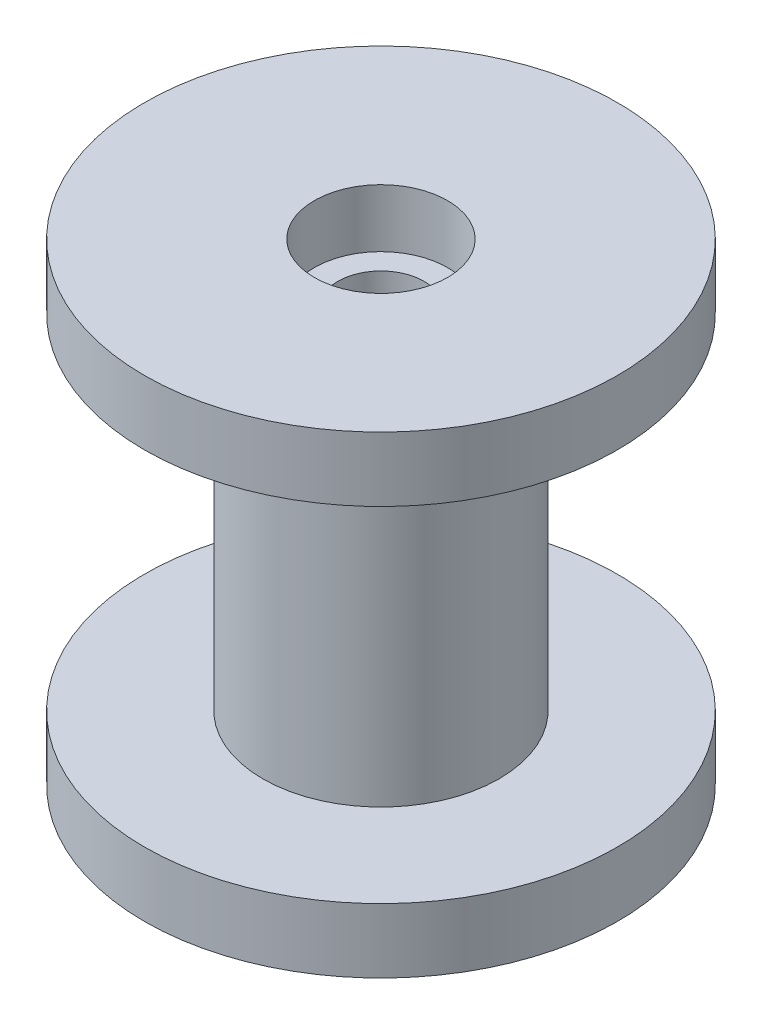
ISO-10303-21;
HEADER;
FILE_DESCRIPTION(('STEP AP214'),'2;1');
FILE_NAME('part.step','',(''),(''),'','','');
FILE_SCHEMA(('AUTOMOTIVE_DESIGN { 1 0 10303 214 1 1 1 1 }'));
ENDSEC;
DATA;
#1=APPLICATION_CONTEXT('core data for automotive mechanical design processes');
#2=APPLICATION_PROTOCOL_DEFINITION('international standard','automotive_design',2000,#1);
#3=PRODUCT_CONTEXT('',#1,'mechanical');
#4=PRODUCT('Part','Part','',(#3));
#5=PRODUCT_RELATED_PRODUCT_CATEGORY('part','',(#4));
#6=PRODUCT_DEFINITION_FORMATION('','',#4);
#7=PRODUCT_DEFINITION_CONTEXT('part definition',#1,'design');
#8=PRODUCT_DEFINITION('design','',#6,#7);
#9=PRODUCT_DEFINITION_SHAPE('','',#8);
#10=(LENGTH_UNIT() NAMED_UNIT(*) SI_UNIT(.MILLI.,.METRE.));
#11=(NAMED_UNIT(*) PLANE_ANGLE_UNIT() SI_UNIT($,.RADIAN.));
#12=(NAMED_UNIT(*) SI_UNIT($,.STERADIAN.) SOLID_ANGLE_UNIT());
#13=UNCERTAINTY_MEASURE_WITH_UNIT(LENGTH_MEASURE(1.E-05),#10,'distance_accuracy_value','');
#14=(GEOMETRIC_REPRESENTATION_CONTEXT(3) GLOBAL_UNCERTAINTY_ASSIGNED_CONTEXT((#13)) GLOBAL_UNIT_ASSIGNED_CONTEXT((#10,
#11,#12)) REPRESENTATION_CONTEXT('',''));
#15=CARTESIAN_POINT('',(0.,0.,0.));
#16=DIRECTION('',(0.,0.,1.));
#17=DIRECTION('',(1.,0.,0.));
#18=AXIS2_PLACEMENT_3D('',#15,#16,#17);
#19=CARTESIAN_POINT('',(0.,-11.,0.));
#20=DIRECTION('',(0.,1.,0.));
#21=DIRECTION('',(0.,0.,1.));
#22=AXIS2_PLACEMENT_3D('',#19,#20,#21);
#23=CYLINDRICAL_SURFACE('',#22,2.);
#24=CARTESIAN_POINT('',(0.,-8.3,0.));
#25=DIRECTION('',(0.,1.,0.));
#26=DIRECTION('',(0.,0.,1.));
#27=AXIS2_PLACEMENT_3D('',#24,#25,#26);
#28=CIRCLE('',#27,2.);
#29=CARTESIAN_POINT('',(0.,-8.3,2.));
#30=VERTEX_POINT('',#29);
#31=EDGE_CURVE('E39',#30,#30,#28,.F.);
#32=ORIENTED_EDGE('',*,*,#31,.T.);
#33=EDGE_LOOP('',(#32));
#34=FACE_BOUND('',#33,.T.);
#35=CARTESIAN_POINT('',(0.,8.3,0.));
#36=DIRECTION('',(0.,1.,0.));
#37=DIRECTION('',(0.,0.,1.));
#38=AXIS2_PLACEMENT_3D('',#35,#36,#37);
#39=CIRCLE('',#38,2.);
#40=CARTESIAN_POINT('',(0.,8.3,2.));
#41=VERTEX_POINT('',#40);
#42=EDGE_CURVE('E53',#41,#41,#39,.F.);
#43=ORIENTED_EDGE('',*,*,#42,.F.);
#44=EDGE_LOOP('',(#43));
#45=FACE_BOUND('',#44,.T.);
#46=ADVANCED_FACE('F35',(#34,#45),#23,.F.);
#47=CARTESIAN_POINT('',(0.,11.,0.));
#48=DIRECTION('',(0.,-1.,0.));
#49=DIRECTION('',(0.,0.,-1.));
#50=AXIS2_PLACEMENT_3D('',#47,#48,#49);
#51=CYLINDRICAL_SURFACE('',#50,11.);
#52=CARTESIAN_POINT('',(0.,8.,0.));
#53=DIRECTION('',(0.,1.,0.));
#54=DIRECTION('',(0.,0.,1.));
#55=AXIS2_PLACEMENT_3D('',#52,#53,#54);
#56=CIRCLE('',#55,11.);
#57=CARTESIAN_POINT('',(0.,8.,11.));
#58=VERTEX_POINT('',#57);
#59=EDGE_CURVE('E48',#58,#58,#56,.T.);
#60=ORIENTED_EDGE('',*,*,#59,.T.);
#61=EDGE_LOOP('',(#60));
#62=FACE_BOUND('',#61,.T.);
#63=CARTESIAN_POINT('',(0.,11.,0.));
#64=DIRECTION('',(0.,1.,0.));
#65=DIRECTION('',(0.,0.,1.));
#66=AXIS2_PLACEMENT_3D('',#63,#64,#65);
#67=CIRCLE('',#66,11.);
#68=CARTESIAN_POINT('',(0.,11.,11.));
#69=VERTEX_POINT('',#68);
#70=EDGE_CURVE('E10',#69,#69,#67,.T.);
#71=ORIENTED_EDGE('',*,*,#70,.F.);
#72=EDGE_LOOP('',(#71));
#73=FACE_BOUND('',#72,.T.);
#74=ADVANCED_FACE('F37',(#62,#73),#51,.T.);
#75=CARTESIAN_POINT('',(0.,11.,0.));
#76=DIRECTION('',(0.,1.,0.));
#77=DIRECTION('',(0.,0.,1.));
#78=AXIS2_PLACEMENT_3D('',#75,#76,#77);
#79=PLANE('',#78);
#80=CARTESIAN_POINT('',(0.,11.,0.));
#81=DIRECTION('',(0.,1.,0.));
#82=DIRECTION('',(0.,0.,1.));
#83=AXIS2_PLACEMENT_3D('',#80,#81,#82);
#84=CIRCLE('',#83,3.1);
#85=CARTESIAN_POINT('',(0.,11.,3.1));
#86=VERTEX_POINT('',#85);
#87=EDGE_CURVE('E63',#86,#86,#84,.T.);
#88=ORIENTED_EDGE('',*,*,#87,.F.);
#89=EDGE_LOOP('',(#88));
#90=FACE_BOUND('',#89,.T.);
#91=ORIENTED_EDGE('',*,*,#70,.T.);
#92=EDGE_LOOP('',(#91));
#93=FACE_BOUND('',#92,.T.);
#94=ADVANCED_FACE('F99',(#90,#93),#79,.T.);
#95=CARTESIAN_POINT('',(0.,8.,0.));
#96=DIRECTION('',(0.,1.,0.));
#97=DIRECTION('',(0.,0.,1.));
#98=AXIS2_PLACEMENT_3D('',#95,#96,#97);
#99=PLANE('',#98);
#100=ORIENTED_EDGE('',*,*,#59,.F.);
#101=EDGE_LOOP('',(#100));
#102=FACE_BOUND('',#101,.T.);
#103=CARTESIAN_POINT('',(0.,8.,0.));
#104=DIRECTION('',(0.,1.,0.));
#105=DIRECTION('',(0.,0.,1.));
#106=AXIS2_PLACEMENT_3D('',#103,#104,#105);
#107=CIRCLE('',#106,5.5);
#108=CARTESIAN_POINT('',(0.,8.,5.5));
#109=VERTEX_POINT('',#108);
#110=EDGE_CURVE('E60',#109,#109,#107,.T.);
#111=ORIENTED_EDGE('',*,*,#110,.T.);
#112=EDGE_LOOP('',(#111));
#113=FACE_BOUND('',#112,.T.);
#114=ADVANCED_FACE('F111',(#102,#113),#99,.F.);
#115=CARTESIAN_POINT('',(0.,-8.,0.));
#116=DIRECTION('',(0.,1.,0.));
#117=DIRECTION('',(0.,0.,1.));
#118=AXIS2_PLACEMENT_3D('',#115,#116,#117);
#119=PLANE('',#118);
#120=CARTESIAN_POINT('',(0.,-8.,0.));
#121=DIRECTION('',(0.,1.,0.));
#122=DIRECTION('',(0.,0.,1.));
#123=AXIS2_PLACEMENT_3D('',#120,#121,#122);
#124=CIRCLE('',#123,11.);
#125=CARTESIAN_POINT('',(0.,-8.,11.));
#126=VERTEX_POINT('',#125);
#127=EDGE_CURVE('E51',#126,#126,#124,.T.);
#128=ORIENTED_EDGE('',*,*,#127,.T.);
#129=EDGE_LOOP('',(#128));
#130=FACE_BOUND('',#129,.T.);
#131=CARTESIAN_POINT('',(0.,-8.,0.));
#132=DIRECTION('',(0.,1.,0.));
#133=DIRECTION('',(0.,0.,1.));
#134=AXIS2_PLACEMENT_3D('',#131,#132,#133);
#135=CIRCLE('',#134,5.5);
#136=CARTESIAN_POINT('',(0.,-8.,5.5));
#137=VERTEX_POINT('',#136);
#138=EDGE_CURVE('E55',#137,#137,#135,.T.);
#139=ORIENTED_EDGE('',*,*,#138,.F.);
#140=EDGE_LOOP('',(#139));
#141=FACE_BOUND('',#140,.T.);
#142=ADVANCED_FACE('F80',(#130,#141),#119,.T.);
#143=CARTESIAN_POINT('',(0.,8.,0.));
#144=DIRECTION('',(0.,-1.,0.));
#145=DIRECTION('',(0.,0.,-1.));
#146=AXIS2_PLACEMENT_3D('',#143,#144,#145);
#147=CYLINDRICAL_SURFACE('',#146,5.5);
#148=ORIENTED_EDGE('',*,*,#110,.F.);
#149=EDGE_LOOP('',(#148));
#150=FACE_BOUND('',#149,.T.);
#151=ORIENTED_EDGE('',*,*,#138,.T.);
#152=EDGE_LOOP('',(#151));
#153=FACE_BOUND('',#152,.T.);
#154=ADVANCED_FACE('F96',(#150,#153),#147,.T.);
#155=CARTESIAN_POINT('',(0.,-11.,0.));
#156=DIRECTION('',(0.,1.,0.));
#157=DIRECTION('',(0.,0.,1.));
#158=AXIS2_PLACEMENT_3D('',#155,#156,#157);
#159=PLANE('',#158);
#160=CARTESIAN_POINT('',(0.,-11.,0.));
#161=DIRECTION('',(0.,1.,0.));
#162=DIRECTION('',(0.,0.,1.));
#163=AXIS2_PLACEMENT_3D('',#160,#161,#162);
#164=CIRCLE('',#163,3.1);
#165=CARTESIAN_POINT('',(0.,-11.,-3.1));
#166=VERTEX_POINT('',#165);
#167=EDGE_CURVE('E70',#166,#166,#164,.T.);
#168=ORIENTED_EDGE('',*,*,#167,.T.);
#169=EDGE_LOOP('',(#168));
#170=FACE_BOUND('',#169,.T.);
#171=CARTESIAN_POINT('',(0.,-11.,0.));
#172=DIRECTION('',(0.,1.,0.));
#173=DIRECTION('',(0.,0.,1.));
#174=AXIS2_PLACEMENT_3D('',#171,#172,#173);
#175=CIRCLE('',#174,11.);
#176=CARTESIAN_POINT('',(0.,-11.,11.));
#177=VERTEX_POINT('',#176);
#178=EDGE_CURVE('E43',#177,#177,#175,.T.);
#179=ORIENTED_EDGE('',*,*,#178,.F.);
#180=EDGE_LOOP('',(#179));
#181=FACE_BOUND('',#180,.T.);
#182=ADVANCED_FACE('F86',(#170,#181),#159,.F.);
#183=ORIENTED_EDGE('',*,*,#178,.T.);
#184=EDGE_LOOP('',(#183));
#185=FACE_BOUND('',#184,.T.);
#186=ORIENTED_EDGE('',*,*,#127,.F.);
#187=EDGE_LOOP('',(#186));
#188=FACE_BOUND('',#187,.T.);
#189=ADVANCED_FACE('F83',(#185,#188),#51,.T.);
#190=CARTESIAN_POINT('',(0.,8.3,0.));
#191=DIRECTION('',(0.,1.,0.));
#192=DIRECTION('',(0.,0.,1.));
#193=AXIS2_PLACEMENT_3D('',#190,#191,#192);
#194=PLANE('',#193);
#195=CARTESIAN_POINT('',(0.,8.3,0.));
#196=DIRECTION('',(0.,1.,0.));
#197=DIRECTION('',(0.,0.,1.));
#198=AXIS2_PLACEMENT_3D('',#195,#196,#197);
#199=CIRCLE('',#198,3.1);
#200=CARTESIAN_POINT('',(0.,8.3,3.1));
#201=VERTEX_POINT('',#200);
#202=EDGE_CURVE('E56',#201,#201,#199,.T.);
#203=ORIENTED_EDGE('',*,*,#202,.T.);
#204=EDGE_LOOP('',(#203));
#205=FACE_BOUND('',#204,.T.);
#206=ORIENTED_EDGE('',*,*,#42,.T.);
#207=EDGE_LOOP('',(#206));
#208=FACE_BOUND('',#207,.T.);
#209=ADVANCED_FACE('F85',(#205,#208),#194,.T.);
#210=CARTESIAN_POINT('',(0.,8.3,0.));
#211=DIRECTION('',(0.,1.,0.));
#212=DIRECTION('',(0.,0.,1.));
#213=AXIS2_PLACEMENT_3D('',#210,#211,#212);
#214=CYLINDRICAL_SURFACE('',#213,3.1);
#215=CARTESIAN_POINT('',(0.,8.3,3.1));
#216=CARTESIAN_POINT('',(0.,8.328125,3.1));
#217=CARTESIAN_POINT('',(0.,8.35625,3.1));
#218=CARTESIAN_POINT('',(0.,8.4125,3.1));
#219=CARTESIAN_POINT('',(0.,8.440625,3.1));
#220=CARTESIAN_POINT('',(0.,8.496875,3.1));
#221=CARTESIAN_POINT('',(0.,8.525,3.1));
#222=CARTESIAN_POINT('',(0.,8.58125,3.1));
#223=CARTESIAN_POINT('',(0.,8.609375,3.1));
#224=CARTESIAN_POINT('',(0.,8.665625,3.1));
#225=CARTESIAN_POINT('',(0.,8.69375,3.1));
#226=CARTESIAN_POINT('',(0.,8.75,3.1));
#227=CARTESIAN_POINT('',(0.,8.778125,3.1));
#228=CARTESIAN_POINT('',(0.,8.834375,3.1));
#229=CARTESIAN_POINT('',(0.,8.8625,3.1));
#230=CARTESIAN_POINT('',(0.,8.91875,3.1));
#231=CARTESIAN_POINT('',(0.,8.946875,3.1));
#232=CARTESIAN_POINT('',(0.,9.003125,3.1));
#233=CARTESIAN_POINT('',(0.,9.03125,3.1));
#234=CARTESIAN_POINT('',(0.,9.0875,3.1));
#235=CARTESIAN_POINT('',(0.,9.115625,3.1));
#236=CARTESIAN_POINT('',(0.,9.171875,3.1));
#237=CARTESIAN_POINT('',(0.,9.2,3.1));
#238=CARTESIAN_POINT('',(0.,9.25625,3.1));
#239=CARTESIAN_POINT('',(0.,9.284375,3.1));
#240=CARTESIAN_POINT('',(0.,9.340625,3.1));
#241=CARTESIAN_POINT('',(0.,9.36875,3.1));
#242=CARTESIAN_POINT('',(0.,9.425,3.1));
#243=CARTESIAN_POINT('',(0.,9.453125,3.1));
#244=CARTESIAN_POINT('',(0.,9.509375,3.1));
#245=CARTESIAN_POINT('',(0.,9.5375,3.1));
#246=CARTESIAN_POINT('',(0.,9.59375,3.1));
#247=CARTESIAN_POINT('',(0.,9.621875,3.1));
#248=CARTESIAN_POINT('',(0.,9.678125,3.1));
#249=CARTESIAN_POINT('',(0.,9.70625,3.1));
#250=CARTESIAN_POINT('',(0.,9.7625,3.1));
#251=CARTESIAN_POINT('',(0.,9.790625,3.1));
#252=CARTESIAN_POINT('',(0.,9.846875,3.1));
#253=CARTESIAN_POINT('',(0.,9.875,3.1));
#254=CARTESIAN_POINT('',(0.,9.93125,3.1));
#255=CARTESIAN_POINT('',(0.,9.959375,3.1));
#256=CARTESIAN_POINT('',(0.,10.015625,3.1));
#257=CARTESIAN_POINT('',(0.,10.04375,3.1));
#258=CARTESIAN_POINT('',(0.,10.1,3.1));
#259=CARTESIAN_POINT('',(0.,10.128125,3.1));
#260=CARTESIAN_POINT('',(0.,10.184375,3.1));
#261=CARTESIAN_POINT('',(0.,10.2125,3.1));
#262=CARTESIAN_POINT('',(0.,10.26875,3.1));
#263=CARTESIAN_POINT('',(0.,10.296875,3.1));
#264=CARTESIAN_POINT('',(0.,10.353125,3.1));
#265=CARTESIAN_POINT('',(0.,10.38125,3.1));
#266=CARTESIAN_POINT('',(0.,10.4375,3.1));
#267=CARTESIAN_POINT('',(0.,10.465625,3.1));
#268=CARTESIAN_POINT('',(0.,10.521875,3.1));
#269=CARTESIAN_POINT('',(0.,10.55,3.1));
#270=CARTESIAN_POINT('',(0.,10.60625,3.1));
#271=CARTESIAN_POINT('',(0.,10.634375,3.1));
#272=CARTESIAN_POINT('',(0.,10.690625,3.1));
#273=CARTESIAN_POINT('',(0.,10.71875,3.1));
#274=CARTESIAN_POINT('',(0.,10.775,3.1));
#275=CARTESIAN_POINT('',(0.,10.803125,3.1));
#276=CARTESIAN_POINT('',(0.,10.859375,3.1));
#277=CARTESIAN_POINT('',(0.,10.8875,3.1));
#278=CARTESIAN_POINT('',(0.,10.94375,3.1));
#279=CARTESIAN_POINT('',(0.,10.971875,3.1));
#280=CARTESIAN_POINT('',(0.,11.,3.1));
#281=B_SPLINE_CURVE_WITH_KNOTS('',3,(#215,#216,#217,#218,#219,#220,#221,#222,#223,#224,#225,
#226,#227,#228,#229,#230,#231,#232,#233,#234,#235,#236,#237,#238,#239,#240,#241,#242,#243,#244,
#245,#246,#247,#248,#249,#250,#251,#252,#253,#254,#255,#256,#257,#258,#259,#260,#261,#262,#263,
#264,#265,#266,#267,#268,#269,#270,#271,#272,#273,#274,#275,#276,#277,#278,#279,#280),
.UNSPECIFIED.,.F.,.F.,(4,2,2,2,2,2,2,2,2,2,2,2,2,2,2,2,2,2,2,2,2,2,2,2,2,2,2,2,2,2,2,2,4),(0.,
0.0843750000000011,0.168750000000001,0.253125000000002,0.337500000000001,0.421875,
0.506250000000002,0.590625000000001,0.675,0.759375000000001,0.843750000000001,0.928125000000002,
1.0125,1.096875,1.18125,1.265625,1.35,1.434375,1.51875,1.603125,1.6875,1.771875,1.85625,
1.940625,2.025,2.109375,2.19375,2.278125,2.3625,2.446875,2.53125,2.615625,2.7),.UNSPECIFIED.);
#282=EDGE_CURVE('BSEAM93',#201,#86,#281,.T.);
#283=ORIENTED_EDGE('',*,*,#202,.F.);
#284=ORIENTED_EDGE('',*,*,#87,.T.);
#285=ORIENTED_EDGE('',*,*,#282,.T.);
#286=ORIENTED_EDGE('',*,*,#282,.F.);
#287=EDGE_LOOP('',(#283,#285,#284,#286));
#288=FACE_BOUND('',#287,.T.);
#289=ADVANCED_FACE('F93',(#288),#214,.F.);
#290=CARTESIAN_POINT('',(0.,-8.3,0.));
#291=DIRECTION('',(0.,1.,0.));
#292=DIRECTION('',(0.,0.,1.));
#293=AXIS2_PLACEMENT_3D('',#290,#291,#292);
#294=PLANE('',#293);
#295=CARTESIAN_POINT('',(0.,-8.3,0.));
#296=DIRECTION('',(0.,1.,0.));
#297=DIRECTION('',(0.,0.,1.));
#298=AXIS2_PLACEMENT_3D('',#295,#296,#297);
#299=CIRCLE('',#298,3.1);
#300=CARTESIAN_POINT('',(0.,-8.3,-3.1));
#301=VERTEX_POINT('',#300);
#302=EDGE_CURVE('E141',#301,#301,#299,.T.);
#303=ORIENTED_EDGE('',*,*,#302,.F.);
#304=EDGE_LOOP('',(#303));
#305=FACE_BOUND('',#304,.T.);
#306=ORIENTED_EDGE('',*,*,#31,.F.);
#307=EDGE_LOOP('',(#306));
#308=FACE_BOUND('',#307,.T.);
#309=ADVANCED_FACE('F125',(#305,#308),#294,.F.);
#310=CARTESIAN_POINT('',(0.,-8.3,0.));
#311=DIRECTION('',(0.,-1.,0.));
#312=DIRECTION('',(0.,0.,-1.));
#313=AXIS2_PLACEMENT_3D('',#310,#311,#312);
#314=CYLINDRICAL_SURFACE('',#313,3.1);
#315=CARTESIAN_POINT('',(0.,-8.3,-3.1));
#316=CARTESIAN_POINT('',(0.,-8.328125,-3.1));
#317=CARTESIAN_POINT('',(0.,-8.35625,-3.1));
#318=CARTESIAN_POINT('',(0.,-8.4125,-3.1));
#319=CARTESIAN_POINT('',(0.,-8.440625,-3.1));
#320=CARTESIAN_POINT('',(0.,-8.496875,-3.1));
#321=CARTESIAN_POINT('',(0.,-8.525,-3.1));
#322=CARTESIAN_POINT('',(0.,-8.58125,-3.1));
#323=CARTESIAN_POINT('',(0.,-8.609375,-3.1));
#324=CARTESIAN_POINT('',(0.,-8.665625,-3.1));
#325=CARTESIAN_POINT('',(0.,-8.69375,-3.1));
#326=CARTESIAN_POINT('',(0.,-8.75,-3.1));
#327=CARTESIAN_POINT('',(0.,-8.778125,-3.1));
#328=CARTESIAN_POINT('',(0.,-8.834375,-3.1));
#329=CARTESIAN_POINT('',(0.,-8.8625,-3.1));
#330=CARTESIAN_POINT('',(0.,-8.91875,-3.1));
#331=CARTESIAN_POINT('',(0.,-8.946875,-3.1));
#332=CARTESIAN_POINT('',(0.,-9.003125,-3.1));
#333=CARTESIAN_POINT('',(0.,-9.03125,-3.1));
#334=CARTESIAN_POINT('',(0.,-9.0875,-3.1));
#335=CARTESIAN_POINT('',(0.,-9.115625,-3.1));
#336=CARTESIAN_POINT('',(0.,-9.171875,-3.1));
#337=CARTESIAN_POINT('',(0.,-9.2,-3.1));
#338=CARTESIAN_POINT('',(0.,-9.25625,-3.1));
#339=CARTESIAN_POINT('',(0.,-9.284375,-3.1));
#340=CARTESIAN_POINT('',(0.,-9.340625,-3.1));
#341=CARTESIAN_POINT('',(0.,-9.36875,-3.1));
#342=CARTESIAN_POINT('',(0.,-9.425,-3.1));
#343=CARTESIAN_POINT('',(0.,-9.453125,-3.1));
#344=CARTESIAN_POINT('',(0.,-9.509375,-3.1));
#345=CARTESIAN_POINT('',(0.,-9.5375,-3.1));
#346=CARTESIAN_POINT('',(0.,-9.59375,-3.1));
#347=CARTESIAN_POINT('',(0.,-9.621875,-3.1));
#348=CARTESIAN_POINT('',(0.,-9.678125,-3.1));
#349=CARTESIAN_POINT('',(0.,-9.70625,-3.1));
#350=CARTESIAN_POINT('',(0.,-9.7625,-3.1));
#351=CARTESIAN_POINT('',(0.,-9.790625,-3.1));
#352=CARTESIAN_POINT('',(0.,-9.846875,-3.1));
#353=CARTESIAN_POINT('',(0.,-9.875,-3.1));
#354=CARTESIAN_POINT('',(0.,-9.93125,-3.1));
#355=CARTESIAN_POINT('',(0.,-9.959375,-3.1));
#356=CARTESIAN_POINT('',(0.,-10.015625,-3.1));
#357=CARTESIAN_POINT('',(0.,-10.04375,-3.1));
#358=CARTESIAN_POINT('',(0.,-10.1,-3.1));
#359=CARTESIAN_POINT('',(0.,-10.128125,-3.1));
#360=CARTESIAN_POINT('',(0.,-10.184375,-3.1));
#361=CARTESIAN_POINT('',(0.,-10.2125,-3.1));
#362=CARTESIAN_POINT('',(0.,-10.26875,-3.1));
#363=CARTESIAN_POINT('',(0.,-10.296875,-3.1));
#364=CARTESIAN_POINT('',(0.,-10.353125,-3.1));
#365=CARTESIAN_POINT('',(0.,-10.38125,-3.1));
#366=CARTESIAN_POINT('',(0.,-10.4375,-3.1));
#367=CARTESIAN_POINT('',(0.,-10.465625,-3.1));
#368=CARTESIAN_POINT('',(0.,-10.521875,-3.1));
#369=CARTESIAN_POINT('',(0.,-10.55,-3.1));
#370=CARTESIAN_POINT('',(0.,-10.60625,-3.1));
#371=CARTESIAN_POINT('',(0.,-10.634375,-3.1));
#372=CARTESIAN_POINT('',(0.,-10.690625,-3.1));
#373=CARTESIAN_POINT('',(0.,-10.71875,-3.1));
#374=CARTESIAN_POINT('',(0.,-10.775,-3.1));
#375=CARTESIAN_POINT('',(0.,-10.803125,-3.1));
#376=CARTESIAN_POINT('',(0.,-10.859375,-3.1));
#377=CARTESIAN_POINT('',(0.,-10.8875,-3.1));
#378=CARTESIAN_POINT('',(0.,-10.94375,-3.1));
#379=CARTESIAN_POINT('',(0.,-10.971875,-3.1));
#380=CARTESIAN_POINT('',(0.,-11.,-3.1));
#381=B_SPLINE_CURVE_WITH_KNOTS('',3,(#315,#316,#317,#318,#319,#320,#321,#322,#323,#324,#325,
#326,#327,#328,#329,#330,#331,#332,#333,#334,#335,#336,#337,#338,#339,#340,#341,#342,#343,#344,
#345,#346,#347,#348,#349,#350,#351,#352,#353,#354,#355,#356,#357,#358,#359,#360,#361,#362,#363,
#364,#365,#366,#367,#368,#369,#370,#371,#372,#373,#374,#375,#376,#377,#378,#379,#380),
.UNSPECIFIED.,.F.,.F.,(4,2,2,2,2,2,2,2,2,2,2,2,2,2,2,2,2,2,2,2,2,2,2,2,2,2,2,2,2,2,2,2,4),(0.,
0.0843750000000011,0.168750000000001,0.253125000000002,0.337500000000001,0.421875,
0.506250000000002,0.590625000000001,0.675000000000002,0.759375000000001,0.843750000000001,
0.928125000000002,1.0125,1.096875,1.18125,1.265625,1.35,1.434375,1.51875,1.603125,1.6875,
1.771875,1.85625,1.940625,2.025,2.109375,2.19375,2.278125,2.3625,2.446875,2.53125,2.615625,2.7),.UNSPECIFIED.);
#382=EDGE_CURVE('BSEAM130',#301,#166,#381,.T.);
#383=ORIENTED_EDGE('',*,*,#302,.T.);
#384=ORIENTED_EDGE('',*,*,#167,.F.);
#385=ORIENTED_EDGE('',*,*,#382,.T.);
#386=ORIENTED_EDGE('',*,*,#382,.F.);
#387=EDGE_LOOP('',(#383,#385,#384,#386));
#388=FACE_BOUND('',#387,.T.);
#389=ADVANCED_FACE('F130',(#388),#314,.F.);
#390=CLOSED_SHELL('',(#46,#74,#94,#114,#142,#154,#182,#189,#209,#289,#309,#389));
#391=MANIFOLD_SOLID_BREP('B2',#390);
#392=ADVANCED_BREP_SHAPE_REPRESENTATION('',(#18,#391),#14);
#393=SHAPE_DEFINITION_REPRESENTATION(#9,#392);
ENDSEC;
END-ISO-10303-21;
